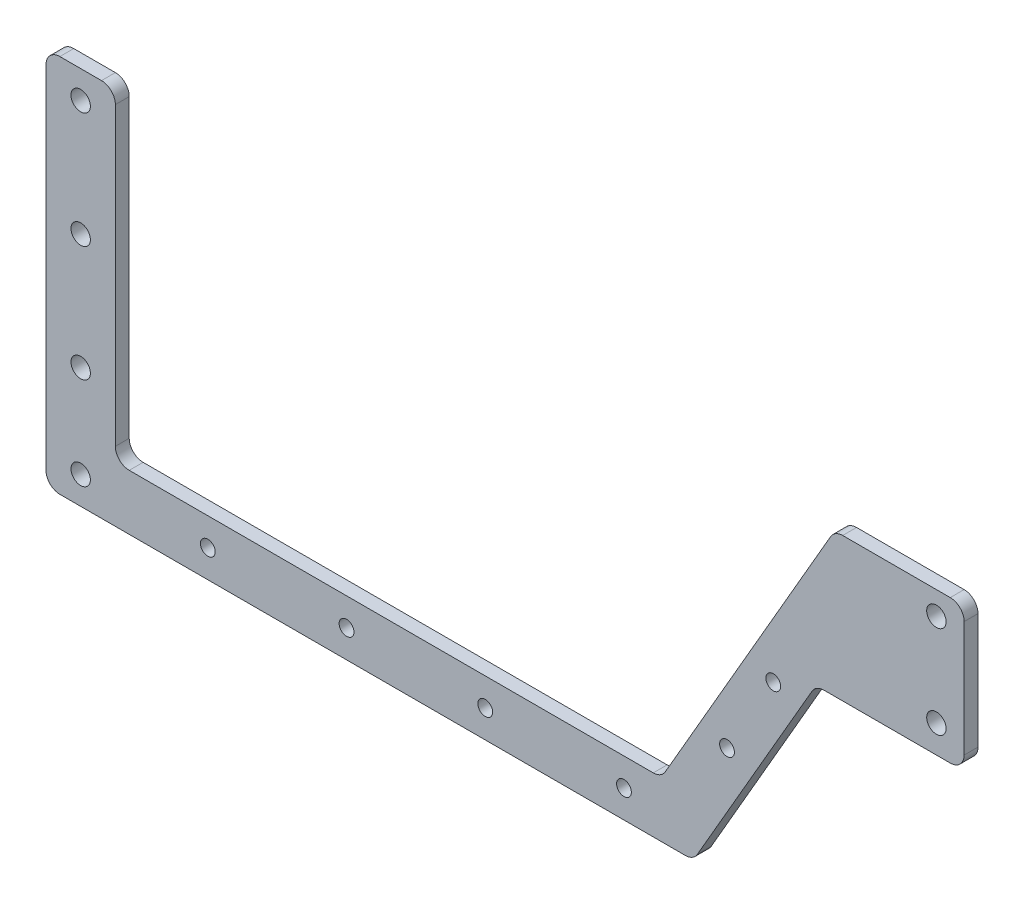
ISO-10303-21;
HEADER;
FILE_DESCRIPTION(('STEP AP214'),'2;1');
FILE_NAME('part.step','',(''),(''),'','','');
FILE_SCHEMA(('AUTOMOTIVE_DESIGN { 1 0 10303 214 1 1 1 1 }'));
ENDSEC;
DATA;
#1=APPLICATION_CONTEXT('core data for automotive mechanical design processes');
#2=APPLICATION_PROTOCOL_DEFINITION('international standard','automotive_design',2000,#1);
#3=PRODUCT_CONTEXT('',#1,'mechanical');
#4=PRODUCT('Part','Part','',(#3));
#5=PRODUCT_RELATED_PRODUCT_CATEGORY('part','',(#4));
#6=PRODUCT_DEFINITION_FORMATION('','',#4);
#7=PRODUCT_DEFINITION_CONTEXT('part definition',#1,'design');
#8=PRODUCT_DEFINITION('design','',#6,#7);
#9=PRODUCT_DEFINITION_SHAPE('','',#8);
#10=(LENGTH_UNIT() NAMED_UNIT(*) SI_UNIT(.MILLI.,.METRE.));
#11=(NAMED_UNIT(*) PLANE_ANGLE_UNIT() SI_UNIT($,.RADIAN.));
#12=(NAMED_UNIT(*) SI_UNIT($,.STERADIAN.) SOLID_ANGLE_UNIT());
#13=UNCERTAINTY_MEASURE_WITH_UNIT(LENGTH_MEASURE(1.E-05),#10,'distance_accuracy_value','');
#14=(GEOMETRIC_REPRESENTATION_CONTEXT(3) GLOBAL_UNCERTAINTY_ASSIGNED_CONTEXT((#13)) GLOBAL_UNIT_ASSIGNED_CONTEXT((#10,
#11,#12)) REPRESENTATION_CONTEXT('',''));
#15=CARTESIAN_POINT('',(0.,0.,0.));
#16=DIRECTION('',(0.,0.,1.));
#17=DIRECTION('',(1.,0.,0.));
#18=AXIS2_PLACEMENT_3D('',#15,#16,#17);
#19=CARTESIAN_POINT('',(0.,0.,3.));
#20=DIRECTION('',(0.,0.,1.));
#21=DIRECTION('',(1.,0.,0.));
#22=AXIS2_PLACEMENT_3D('',#19,#20,#21);
#23=PLANE('',#22);
#24=CARTESIAN_POINT('',(-41.2790561913611,-4.,3.));
#25=DIRECTION('',(0.,0.,1.));
#26=DIRECTION('',(1.,0.,0.));
#27=AXIS2_PLACEMENT_3D('',#24,#25,#26);
#28=CIRCLE('',#27,1.6);
#29=CARTESIAN_POINT('',(-39.6790561913612,-4.,3.));
#30=VERTEX_POINT('',#29);
#31=EDGE_CURVE('E622',#30,#30,#28,.T.);
#32=ORIENTED_EDGE('',*,*,#31,.F.);
#33=EDGE_LOOP('',(#32));
#34=FACE_BOUND('',#33,.T.);
#35=CARTESIAN_POINT('',(-163.571796769724,-39.951905283833,3.));
#36=DIRECTION('',(0.,0.,1.));
#37=DIRECTION('',(1.,0.,0.));
#38=AXIS2_PLACEMENT_3D('',#35,#36,#37);
#39=CIRCLE('',#38,1.59999999999999);
#40=CARTESIAN_POINT('',(-161.971796769724,-39.951905283833,3.));
#41=VERTEX_POINT('',#40);
#42=EDGE_CURVE('E623',#41,#41,#39,.T.);
#43=ORIENTED_EDGE('',*,*,#42,.F.);
#44=EDGE_LOOP('',(#43));
#45=FACE_BOUND('',#44,.T.);
#46=CARTESIAN_POINT('',(-191.071796769724,-19.951905283833,3.));
#47=DIRECTION('',(0.,0.,1.));
#48=DIRECTION('',(1.,0.,0.));
#49=AXIS2_PLACEMENT_3D('',#46,#47,#48);
#50=CIRCLE('',#49,2.09999999999999);
#51=CARTESIAN_POINT('',(-188.971796769724,-19.951905283833,3.));
#52=VERTEX_POINT('',#51);
#53=EDGE_CURVE('E449',#52,#52,#50,.T.);
#54=ORIENTED_EDGE('',*,*,#53,.F.);
#55=EDGE_LOOP('',(#54));
#56=FACE_BOUND('',#55,.T.);
#57=CARTESIAN_POINT('',(-191.071796769724,5.048094716167,3.));
#58=DIRECTION('',(0.,0.,1.));
#59=DIRECTION('',(1.,0.,0.));
#60=AXIS2_PLACEMENT_3D('',#57,#58,#59);
#61=CIRCLE('',#60,2.09999999999999);
#62=CARTESIAN_POINT('',(-188.971796769724,5.048094716167,3.));
#63=VERTEX_POINT('',#62);
#64=EDGE_CURVE('E415',#63,#63,#61,.T.);
#65=ORIENTED_EDGE('',*,*,#64,.F.);
#66=EDGE_LOOP('',(#65));
#67=FACE_BOUND('',#66,.T.);
#68=CARTESIAN_POINT('',(-191.071796769724,30.048094716167,3.));
#69=DIRECTION('',(0.,0.,1.));
#70=DIRECTION('',(1.,0.,0.));
#71=AXIS2_PLACEMENT_3D('',#68,#69,#70);
#72=CIRCLE('',#71,2.09999999999999);
#73=CARTESIAN_POINT('',(-188.971796769724,30.048094716167,3.));
#74=VERTEX_POINT('',#73);
#75=EDGE_CURVE('E431',#74,#74,#72,.T.);
#76=ORIENTED_EDGE('',*,*,#75,.F.);
#77=EDGE_LOOP('',(#76));
#78=FACE_BOUND('',#77,.T.);
#79=CARTESIAN_POINT('',(-191.071796769724,-39.951905283833,3.));
#80=DIRECTION('',(0.,0.,1.));
#81=DIRECTION('',(1.,0.,0.));
#82=AXIS2_PLACEMENT_3D('',#79,#80,#81);
#83=CIRCLE('',#82,2.09999999999999);
#84=CARTESIAN_POINT('',(-188.971796769724,-39.951905283833,3.));
#85=VERTEX_POINT('',#84);
#86=EDGE_CURVE('E440',#85,#85,#83,.T.);
#87=ORIENTED_EDGE('',*,*,#86,.F.);
#88=EDGE_LOOP('',(#87));
#89=FACE_BOUND('',#88,.T.);
#90=CARTESIAN_POINT('',(-133.571796769724,-39.951905283833,3.));
#91=DIRECTION('',(0.,0.,1.));
#92=DIRECTION('',(1.,0.,0.));
#93=AXIS2_PLACEMENT_3D('',#90,#91,#92);
#94=CIRCLE('',#93,1.59999999999999);
#95=CARTESIAN_POINT('',(-131.971796769724,-39.951905283833,3.));
#96=VERTEX_POINT('',#95);
#97=EDGE_CURVE('E448',#96,#96,#94,.T.);
#98=ORIENTED_EDGE('',*,*,#97,.F.);
#99=EDGE_LOOP('',(#98));
#100=FACE_BOUND('',#99,.T.);
#101=CARTESIAN_POINT('',(-103.571796769724,-39.951905283833,3.));
#102=DIRECTION('',(0.,0.,1.));
#103=DIRECTION('',(1.,0.,0.));
#104=AXIS2_PLACEMENT_3D('',#101,#102,#103);
#105=CIRCLE('',#104,1.60000000000002);
#106=CARTESIAN_POINT('',(-101.971796769724,-39.951905283833,3.));
#107=VERTEX_POINT('',#106);
#108=EDGE_CURVE('E483',#107,#107,#105,.T.);
#109=ORIENTED_EDGE('',*,*,#108,.F.);
#110=EDGE_LOOP('',(#109));
#111=FACE_BOUND('',#110,.T.);
#112=CARTESIAN_POINT('',(-73.5717967697243,-39.951905283833,3.));
#113=DIRECTION('',(0.,0.,1.));
#114=DIRECTION('',(1.,0.,0.));
#115=AXIS2_PLACEMENT_3D('',#112,#113,#114);
#116=CIRCLE('',#115,1.60000000000001);
#117=CARTESIAN_POINT('',(-71.9717967697243,-39.951905283833,3.));
#118=VERTEX_POINT('',#117);
#119=EDGE_CURVE('E487',#118,#118,#116,.T.);
#120=ORIENTED_EDGE('',*,*,#119,.F.);
#121=EDGE_LOOP('',(#120));
#122=FACE_BOUND('',#121,.T.);
#123=CARTESIAN_POINT('',(-51.2790561913611,-21.3205080756888,3.));
#124=DIRECTION('',(0.,0.,1.));
#125=DIRECTION('',(1.,0.,0.));
#126=AXIS2_PLACEMENT_3D('',#123,#124,#125);
#127=CIRCLE('',#126,1.6);
#128=CARTESIAN_POINT('',(-49.6790561913612,-21.3205080756888,3.));
#129=VERTEX_POINT('',#128);
#130=EDGE_CURVE('E491',#129,#129,#127,.T.);
#131=ORIENTED_EDGE('',*,*,#130,.F.);
#132=EDGE_LOOP('',(#131));
#133=FACE_BOUND('',#132,.T.);
#134=CARTESIAN_POINT('',(-6.,26.,3.));
#135=DIRECTION('',(0.,0.,1.));
#136=DIRECTION('',(1.,0.,0.));
#137=AXIS2_PLACEMENT_3D('',#134,#135,#136);
#138=CIRCLE('',#137,2.1);
#139=CARTESIAN_POINT('',(-3.9,26.,3.));
#140=VERTEX_POINT('',#139);
#141=EDGE_CURVE('E209',#140,#140,#138,.T.);
#142=ORIENTED_EDGE('',*,*,#141,.F.);
#143=EDGE_LOOP('',(#142));
#144=FACE_BOUND('',#143,.T.);
#145=DIRECTION('',(1.,0.,0.));
#146=VECTOR('',#145,1.);
#147=CARTESIAN_POINT('',(-198.571796769724,-45.951905283833,3.));
#148=LINE('',#147,#146);
#149=CARTESIAN_POINT('',(-195.571796769724,-45.951905283833,3.));
#150=VERTEX_POINT('',#149);
#151=CARTESIAN_POINT('',(-60.3038475772932,-45.951905283833,3.));
#152=VERTEX_POINT('',#151);
#153=EDGE_CURVE('E282',#150,#152,#148,.T.);
#154=ORIENTED_EDGE('',*,*,#153,.T.);
#155=CARTESIAN_POINT('',(-60.3038475772932,-42.951905283833,3.));
#156=DIRECTION('',(0.,0.,1.));
#157=DIRECTION('',(1.,0.,0.));
#158=AXIS2_PLACEMENT_3D('',#155,#156,#157);
#159=CIRCLE('',#158,3.);
#160=CARTESIAN_POINT('',(-57.7057713659398,-44.4519052838329,3.));
#161=VERTEX_POINT('',#160);
#162=EDGE_CURVE('E296',#152,#161,#159,.T.);
#163=ORIENTED_EDGE('',*,*,#162,.T.);
#164=DIRECTION('',(0.499999999999998,0.86602540378444,0.));
#165=VECTOR('',#164,1.);
#166=CARTESIAN_POINT('',(-58.5717967697243,-45.951905283833,3.));
#167=LINE('',#166,#165);
#168=CARTESIAN_POINT('',(-32.9074772881117,-1.50000000000002,3.));
#169=VERTEX_POINT('',#168);
#170=EDGE_CURVE('E219',#161,#169,#167,.T.);
#171=ORIENTED_EDGE('',*,*,#170,.T.);
#172=CARTESIAN_POINT('',(-30.3094010767584,-3.,3.));
#173=DIRECTION('',(0.,0.,1.));
#174=DIRECTION('',(1.,0.,0.));
#175=AXIS2_PLACEMENT_3D('',#172,#173,#174);
#176=CIRCLE('',#175,3.);
#177=CARTESIAN_POINT('',(-30.3094010767584,0.,3.));
#178=VERTEX_POINT('',#177);
#179=EDGE_CURVE('E190',#169,#178,#176,.F.);
#180=ORIENTED_EDGE('',*,*,#179,.T.);
#181=DIRECTION('',(1.,0.,0.));
#182=VECTOR('',#181,1.);
#183=CARTESIAN_POINT('',(-32.0414518843273,0.,3.));
#184=LINE('',#183,#182);
#185=CARTESIAN_POINT('',(-3.,0.,3.));
#186=VERTEX_POINT('',#185);
#187=EDGE_CURVE('E200',#178,#186,#184,.T.);
#188=ORIENTED_EDGE('',*,*,#187,.T.);
#189=CARTESIAN_POINT('',(-3.,3.,3.));
#190=DIRECTION('',(0.,0.,1.));
#191=DIRECTION('',(1.,0.,0.));
#192=AXIS2_PLACEMENT_3D('',#189,#190,#191);
#193=CIRCLE('',#192,3.);
#194=CARTESIAN_POINT('',(0.,3.,3.));
#195=VERTEX_POINT('',#194);
#196=EDGE_CURVE('E269',#186,#195,#193,.T.);
#197=ORIENTED_EDGE('',*,*,#196,.T.);
#198=DIRECTION('',(0.,1.,0.));
#199=VECTOR('',#198,1.);
#200=CARTESIAN_POINT('',(0.,0.,3.));
#201=LINE('',#200,#199);
#202=CARTESIAN_POINT('',(0.,28.,3.));
#203=VERTEX_POINT('',#202);
#204=EDGE_CURVE('E395',#195,#203,#201,.T.);
#205=ORIENTED_EDGE('',*,*,#204,.T.);
#206=CARTESIAN_POINT('',(-3.,28.,3.));
#207=DIRECTION('',(0.,0.,1.));
#208=DIRECTION('',(1.,0.,0.));
#209=AXIS2_PLACEMENT_3D('',#206,#207,#208);
#210=CIRCLE('',#209,3.);
#211=CARTESIAN_POINT('',(-3.,31.,3.));
#212=VERTEX_POINT('',#211);
#213=EDGE_CURVE('E386',#203,#212,#210,.T.);
#214=ORIENTED_EDGE('',*,*,#213,.T.);
#215=DIRECTION('',(-1.,0.,0.));
#216=VECTOR('',#215,1.);
#217=CARTESIAN_POINT('',(0.,31.,3.));
#218=LINE('',#217,#216);
#219=CARTESIAN_POINT('',(-26.2679491924311,31.,3.));
#220=VERTEX_POINT('',#219);
#221=EDGE_CURVE('E369',#212,#220,#218,.T.);
#222=ORIENTED_EDGE('',*,*,#221,.T.);
#223=CARTESIAN_POINT('',(-26.2679491924311,28.,3.));
#224=DIRECTION('',(0.,0.,1.));
#225=DIRECTION('',(1.,0.,0.));
#226=AXIS2_PLACEMENT_3D('',#223,#224,#225);
#227=CIRCLE('',#226,3.);
#228=CARTESIAN_POINT('',(-28.8660254037844,29.5,3.));
#229=VERTEX_POINT('',#228);
#230=EDGE_CURVE('E383',#220,#229,#227,.T.);
#231=ORIENTED_EDGE('',*,*,#230,.T.);
#232=DIRECTION('',(-0.499999999999998,-0.86602540378444,0.));
#233=VECTOR('',#232,1.);
#234=CARTESIAN_POINT('',(-28.,31.,3.));
#235=LINE('',#234,#233);
#236=CARTESIAN_POINT('',(-64.6339745962154,-32.451905283833,3.));
#237=VERTEX_POINT('',#236);
#238=EDGE_CURVE('E359',#229,#237,#235,.T.);
#239=ORIENTED_EDGE('',*,*,#238,.T.);
#240=CARTESIAN_POINT('',(-67.2320508075687,-30.951905283833,3.));
#241=DIRECTION('',(0.,0.,1.));
#242=DIRECTION('',(1.,0.,0.));
#243=AXIS2_PLACEMENT_3D('',#240,#241,#242);
#244=CIRCLE('',#243,3.);
#245=CARTESIAN_POINT('',(-67.2320508075687,-33.951905283833,3.));
#246=VERTEX_POINT('',#245);
#247=EDGE_CURVE('E12',#237,#246,#244,.F.);
#248=ORIENTED_EDGE('',*,*,#247,.T.);
#249=DIRECTION('',(-1.,0.,0.));
#250=VECTOR('',#249,1.);
#251=CARTESIAN_POINT('',(-65.4999999999998,-33.951905283833,3.));
#252=LINE('',#251,#250);
#253=CARTESIAN_POINT('',(-180.571796769724,-33.951905283833,3.));
#254=VERTEX_POINT('',#253);
#255=EDGE_CURVE('E357',#246,#254,#252,.T.);
#256=ORIENTED_EDGE('',*,*,#255,.T.);
#257=CARTESIAN_POINT('',(-180.571796769724,-30.951905283833,3.));
#258=DIRECTION('',(0.,0.,1.));
#259=DIRECTION('',(1.,0.,0.));
#260=AXIS2_PLACEMENT_3D('',#257,#258,#259);
#261=CIRCLE('',#260,3.);
#262=CARTESIAN_POINT('',(-183.571796769724,-30.951905283833,3.));
#263=VERTEX_POINT('',#262);
#264=EDGE_CURVE('E340',#254,#263,#261,.F.);
#265=ORIENTED_EDGE('',*,*,#264,.T.);
#266=DIRECTION('',(0.,1.,0.));
#267=VECTOR('',#266,1.);
#268=CARTESIAN_POINT('',(-183.571796769724,-33.951905283833,3.));
#269=LINE('',#268,#267);
#270=CARTESIAN_POINT('',(-183.571796769724,33.048094716167,3.));
#271=VERTEX_POINT('',#270);
#272=EDGE_CURVE('E364',#263,#271,#269,.T.);
#273=ORIENTED_EDGE('',*,*,#272,.T.);
#274=CARTESIAN_POINT('',(-186.571796769724,33.048094716167,3.));
#275=DIRECTION('',(0.,0.,1.));
#276=DIRECTION('',(1.,0.,0.));
#277=AXIS2_PLACEMENT_3D('',#274,#275,#276);
#278=CIRCLE('',#277,3.);
#279=CARTESIAN_POINT('',(-186.571796769724,36.048094716167,3.));
#280=VERTEX_POINT('',#279);
#281=EDGE_CURVE('E379',#271,#280,#278,.T.);
#282=ORIENTED_EDGE('',*,*,#281,.T.);
#283=DIRECTION('',(-1.,0.,0.));
#284=VECTOR('',#283,1.);
#285=CARTESIAN_POINT('',(-183.571796769724,36.048094716167,3.));
#286=LINE('',#285,#284);
#287=CARTESIAN_POINT('',(-195.571796769724,36.048094716167,3.));
#288=VERTEX_POINT('',#287);
#289=EDGE_CURVE('E283',#280,#288,#286,.T.);
#290=ORIENTED_EDGE('',*,*,#289,.T.);
#291=CARTESIAN_POINT('',(-195.571796769724,33.048094716167,3.));
#292=DIRECTION('',(0.,0.,1.));
#293=DIRECTION('',(1.,0.,0.));
#294=AXIS2_PLACEMENT_3D('',#291,#292,#293);
#295=CIRCLE('',#294,3.);
#296=CARTESIAN_POINT('',(-198.571796769724,33.048094716167,3.));
#297=VERTEX_POINT('',#296);
#298=EDGE_CURVE('E64',#288,#297,#295,.T.);
#299=ORIENTED_EDGE('',*,*,#298,.T.);
#300=DIRECTION('',(0.,-1.,0.));
#301=VECTOR('',#300,1.);
#302=CARTESIAN_POINT('',(-198.571796769724,36.048094716167,3.));
#303=LINE('',#302,#301);
#304=CARTESIAN_POINT('',(-198.571796769724,-42.951905283833,3.));
#305=VERTEX_POINT('',#304);
#306=EDGE_CURVE('E279',#297,#305,#303,.T.);
#307=ORIENTED_EDGE('',*,*,#306,.T.);
#308=CARTESIAN_POINT('',(-195.571796769724,-42.951905283833,3.));
#309=DIRECTION('',(0.,0.,1.));
#310=DIRECTION('',(1.,0.,0.));
#311=AXIS2_PLACEMENT_3D('',#308,#309,#310);
#312=CIRCLE('',#311,3.);
#313=EDGE_CURVE('E301',#305,#150,#312,.T.);
#314=ORIENTED_EDGE('',*,*,#313,.T.);
#315=EDGE_LOOP('',(#154,#163,#171,#180,#188,#197,#205,#214,#222,#231,#239,#248,#256,#265,#273,
#282,#290,#299,#307,#314));
#316=FACE_BOUND('',#315,.T.);
#317=CARTESIAN_POINT('',(-6.,6.,3.));
#318=DIRECTION('',(0.,0.,1.));
#319=DIRECTION('',(1.,0.,0.));
#320=AXIS2_PLACEMENT_3D('',#317,#318,#319);
#321=CIRCLE('',#320,2.1);
#322=CARTESIAN_POINT('',(-3.9,6.,3.));
#323=VERTEX_POINT('',#322);
#324=EDGE_CURVE('E405',#323,#323,#321,.T.);
#325=ORIENTED_EDGE('',*,*,#324,.F.);
#326=EDGE_LOOP('',(#325));
#327=FACE_BOUND('',#326,.T.);
#328=ADVANCED_FACE('F41',(#34,#45,#56,#67,#78,#89,#100,#111,#122,#133,#144,#316,#327),#23,.T.);
#329=CARTESIAN_POINT('',(0.,0.,0.));
#330=DIRECTION('',(0.,0.,1.));
#331=DIRECTION('',(1.,0.,0.));
#332=AXIS2_PLACEMENT_3D('',#329,#330,#331);
#333=PLANE('',#332);
#334=CARTESIAN_POINT('',(-41.2790561913611,-4.,0.));
#335=DIRECTION('',(0.,0.,1.));
#336=DIRECTION('',(1.,0.,0.));
#337=AXIS2_PLACEMENT_3D('',#334,#335,#336);
#338=CIRCLE('',#337,1.6);
#339=CARTESIAN_POINT('',(-39.6790561913612,-4.,0.));
#340=VERTEX_POINT('',#339);
#341=EDGE_CURVE('E410',#340,#340,#338,.T.);
#342=ORIENTED_EDGE('',*,*,#341,.T.);
#343=EDGE_LOOP('',(#342));
#344=FACE_BOUND('',#343,.T.);
#345=CARTESIAN_POINT('',(-163.571796769724,-39.951905283833,0.));
#346=DIRECTION('',(0.,0.,1.));
#347=DIRECTION('',(1.,0.,0.));
#348=AXIS2_PLACEMENT_3D('',#345,#346,#347);
#349=CIRCLE('',#348,1.59999999999999);
#350=CARTESIAN_POINT('',(-161.971796769724,-39.951905283833,0.));
#351=VERTEX_POINT('',#350);
#352=EDGE_CURVE('E445',#351,#351,#349,.T.);
#353=ORIENTED_EDGE('',*,*,#352,.T.);
#354=EDGE_LOOP('',(#353));
#355=FACE_BOUND('',#354,.T.);
#356=CARTESIAN_POINT('',(-191.071796769724,-19.951905283833,0.));
#357=DIRECTION('',(0.,0.,1.));
#358=DIRECTION('',(1.,0.,0.));
#359=AXIS2_PLACEMENT_3D('',#356,#357,#358);
#360=CIRCLE('',#359,2.09999999999999);
#361=CARTESIAN_POINT('',(-188.971796769724,-19.951905283833,0.));
#362=VERTEX_POINT('',#361);
#363=EDGE_CURVE('E446',#362,#362,#360,.T.);
#364=ORIENTED_EDGE('',*,*,#363,.T.);
#365=EDGE_LOOP('',(#364));
#366=FACE_BOUND('',#365,.T.);
#367=CARTESIAN_POINT('',(-191.071796769724,5.048094716167,0.));
#368=DIRECTION('',(0.,0.,1.));
#369=DIRECTION('',(1.,0.,0.));
#370=AXIS2_PLACEMENT_3D('',#367,#368,#369);
#371=CIRCLE('',#370,2.09999999999999);
#372=CARTESIAN_POINT('',(-188.971796769724,5.048094716167,0.));
#373=VERTEX_POINT('',#372);
#374=EDGE_CURVE('E420',#373,#373,#371,.T.);
#375=ORIENTED_EDGE('',*,*,#374,.T.);
#376=EDGE_LOOP('',(#375));
#377=FACE_BOUND('',#376,.T.);
#378=CARTESIAN_POINT('',(-191.071796769724,30.048094716167,0.));
#379=DIRECTION('',(0.,0.,1.));
#380=DIRECTION('',(1.,0.,0.));
#381=AXIS2_PLACEMENT_3D('',#378,#379,#380);
#382=CIRCLE('',#381,2.09999999999999);
#383=CARTESIAN_POINT('',(-188.971796769724,30.048094716167,0.));
#384=VERTEX_POINT('',#383);
#385=EDGE_CURVE('E421',#384,#384,#382,.T.);
#386=ORIENTED_EDGE('',*,*,#385,.T.);
#387=EDGE_LOOP('',(#386));
#388=FACE_BOUND('',#387,.T.);
#389=CARTESIAN_POINT('',(-191.071796769724,-39.951905283833,0.));
#390=DIRECTION('',(0.,0.,1.));
#391=DIRECTION('',(1.,0.,0.));
#392=AXIS2_PLACEMENT_3D('',#389,#390,#391);
#393=CIRCLE('',#392,2.09999999999999);
#394=CARTESIAN_POINT('',(-188.971796769724,-39.951905283833,0.));
#395=VERTEX_POINT('',#394);
#396=EDGE_CURVE('E437',#395,#395,#393,.T.);
#397=ORIENTED_EDGE('',*,*,#396,.T.);
#398=EDGE_LOOP('',(#397));
#399=FACE_BOUND('',#398,.T.);
#400=CARTESIAN_POINT('',(-133.571796769724,-39.951905283833,0.));
#401=DIRECTION('',(0.,0.,1.));
#402=DIRECTION('',(1.,0.,0.));
#403=AXIS2_PLACEMENT_3D('',#400,#401,#402);
#404=CIRCLE('',#403,1.59999999999999);
#405=CARTESIAN_POINT('',(-131.971796769724,-39.951905283833,0.));
#406=VERTEX_POINT('',#405);
#407=EDGE_CURVE('E604',#406,#406,#404,.T.);
#408=ORIENTED_EDGE('',*,*,#407,.T.);
#409=EDGE_LOOP('',(#408));
#410=FACE_BOUND('',#409,.T.);
#411=CARTESIAN_POINT('',(-103.571796769724,-39.951905283833,0.));
#412=DIRECTION('',(0.,0.,1.));
#413=DIRECTION('',(1.,0.,0.));
#414=AXIS2_PLACEMENT_3D('',#411,#412,#413);
#415=CIRCLE('',#414,1.60000000000002);
#416=CARTESIAN_POINT('',(-101.971796769724,-39.951905283833,0.));
#417=VERTEX_POINT('',#416);
#418=EDGE_CURVE('E601',#417,#417,#415,.T.);
#419=ORIENTED_EDGE('',*,*,#418,.T.);
#420=EDGE_LOOP('',(#419));
#421=FACE_BOUND('',#420,.T.);
#422=CARTESIAN_POINT('',(-73.5717967697243,-39.951905283833,0.));
#423=DIRECTION('',(0.,0.,1.));
#424=DIRECTION('',(1.,0.,0.));
#425=AXIS2_PLACEMENT_3D('',#422,#423,#424);
#426=CIRCLE('',#425,1.60000000000001);
#427=CARTESIAN_POINT('',(-71.9717967697243,-39.951905283833,0.));
#428=VERTEX_POINT('',#427);
#429=EDGE_CURVE('E598',#428,#428,#426,.T.);
#430=ORIENTED_EDGE('',*,*,#429,.T.);
#431=EDGE_LOOP('',(#430));
#432=FACE_BOUND('',#431,.T.);
#433=CARTESIAN_POINT('',(-51.2790561913611,-21.3205080756888,0.));
#434=DIRECTION('',(0.,0.,1.));
#435=DIRECTION('',(1.,0.,0.));
#436=AXIS2_PLACEMENT_3D('',#433,#434,#435);
#437=CIRCLE('',#436,1.6);
#438=CARTESIAN_POINT('',(-49.6790561913612,-21.3205080756888,0.));
#439=VERTEX_POINT('',#438);
#440=EDGE_CURVE('E597',#439,#439,#437,.T.);
#441=ORIENTED_EDGE('',*,*,#440,.T.);
#442=EDGE_LOOP('',(#441));
#443=FACE_BOUND('',#442,.T.);
#444=DIRECTION('',(0.499999999999998,0.86602540378444,0.));
#445=VECTOR('',#444,1.);
#446=CARTESIAN_POINT('',(-58.5717967697243,-45.951905283833,0.));
#447=LINE('',#446,#445);
#448=CARTESIAN_POINT('',(-57.7057713659398,-44.4519052838329,0.));
#449=VERTEX_POINT('',#448);
#450=CARTESIAN_POINT('',(-32.9074772881117,-1.50000000000002,0.));
#451=VERTEX_POINT('',#450);
#452=EDGE_CURVE('E242',#449,#451,#447,.T.);
#453=ORIENTED_EDGE('',*,*,#452,.F.);
#454=CARTESIAN_POINT('',(-60.3038475772932,-42.951905283833,0.));
#455=DIRECTION('',(0.,0.,1.));
#456=DIRECTION('',(1.,0.,0.));
#457=AXIS2_PLACEMENT_3D('',#454,#455,#456);
#458=CIRCLE('',#457,3.);
#459=CARTESIAN_POINT('',(-60.3038475772932,-45.951905283833,0.));
#460=VERTEX_POINT('',#459);
#461=EDGE_CURVE('E259',#449,#460,#458,.F.);
#462=ORIENTED_EDGE('',*,*,#461,.T.);
#463=DIRECTION('',(1.,0.,0.));
#464=VECTOR('',#463,1.);
#465=CARTESIAN_POINT('',(-198.571796769724,-45.951905283833,0.));
#466=LINE('',#465,#464);
#467=CARTESIAN_POINT('',(-195.571796769724,-45.951905283833,0.));
#468=VERTEX_POINT('',#467);
#469=EDGE_CURVE('E239',#468,#460,#466,.T.);
#470=ORIENTED_EDGE('',*,*,#469,.F.);
#471=CARTESIAN_POINT('',(-195.571796769724,-42.951905283833,0.));
#472=DIRECTION('',(0.,0.,1.));
#473=DIRECTION('',(1.,0.,0.));
#474=AXIS2_PLACEMENT_3D('',#471,#472,#473);
#475=CIRCLE('',#474,3.);
#476=CARTESIAN_POINT('',(-198.571796769724,-42.951905283833,0.));
#477=VERTEX_POINT('',#476);
#478=EDGE_CURVE('E257',#468,#477,#475,.F.);
#479=ORIENTED_EDGE('',*,*,#478,.T.);
#480=DIRECTION('',(0.,-1.,0.));
#481=VECTOR('',#480,1.);
#482=CARTESIAN_POINT('',(-198.571796769724,36.048094716167,0.));
#483=LINE('',#482,#481);
#484=CARTESIAN_POINT('',(-198.571796769724,33.048094716167,0.));
#485=VERTEX_POINT('',#484);
#486=EDGE_CURVE('E237',#485,#477,#483,.T.);
#487=ORIENTED_EDGE('',*,*,#486,.F.);
#488=CARTESIAN_POINT('',(-195.571796769724,33.048094716167,0.));
#489=DIRECTION('',(0.,0.,1.));
#490=DIRECTION('',(1.,0.,0.));
#491=AXIS2_PLACEMENT_3D('',#488,#489,#490);
#492=CIRCLE('',#491,3.);
#493=CARTESIAN_POINT('',(-195.571796769724,36.048094716167,0.));
#494=VERTEX_POINT('',#493);
#495=EDGE_CURVE('E248',#485,#494,#492,.F.);
#496=ORIENTED_EDGE('',*,*,#495,.T.);
#497=DIRECTION('',(-1.,0.,0.));
#498=VECTOR('',#497,1.);
#499=CARTESIAN_POINT('',(-183.571796769724,36.048094716167,0.));
#500=LINE('',#499,#498);
#501=CARTESIAN_POINT('',(-186.571796769724,36.048094716167,0.));
#502=VERTEX_POINT('',#501);
#503=EDGE_CURVE('E234',#502,#494,#500,.T.);
#504=ORIENTED_EDGE('',*,*,#503,.F.);
#505=CARTESIAN_POINT('',(-186.571796769724,33.048094716167,0.));
#506=DIRECTION('',(0.,0.,1.));
#507=DIRECTION('',(1.,0.,0.));
#508=AXIS2_PLACEMENT_3D('',#505,#506,#507);
#509=CIRCLE('',#508,3.);
#510=CARTESIAN_POINT('',(-183.571796769724,33.048094716167,0.));
#511=VERTEX_POINT('',#510);
#512=EDGE_CURVE('E255',#502,#511,#509,.F.);
#513=ORIENTED_EDGE('',*,*,#512,.T.);
#514=DIRECTION('',(0.,1.,0.));
#515=VECTOR('',#514,1.);
#516=CARTESIAN_POINT('',(-183.571796769724,-33.951905283833,0.));
#517=LINE('',#516,#515);
#518=CARTESIAN_POINT('',(-183.571796769724,-30.951905283833,0.));
#519=VERTEX_POINT('',#518);
#520=EDGE_CURVE('E231',#519,#511,#517,.T.);
#521=ORIENTED_EDGE('',*,*,#520,.F.);
#522=CARTESIAN_POINT('',(-180.571796769724,-30.951905283833,0.));
#523=DIRECTION('',(0.,0.,1.));
#524=DIRECTION('',(1.,0.,0.));
#525=AXIS2_PLACEMENT_3D('',#522,#523,#524);
#526=CIRCLE('',#525,3.);
#527=CARTESIAN_POINT('',(-180.571796769724,-33.951905283833,0.));
#528=VERTEX_POINT('',#527);
#529=EDGE_CURVE('E338',#519,#528,#526,.T.);
#530=ORIENTED_EDGE('',*,*,#529,.T.);
#531=DIRECTION('',(-1.,0.,0.));
#532=VECTOR('',#531,1.);
#533=CARTESIAN_POINT('',(-65.4999999999998,-33.951905283833,0.));
#534=LINE('',#533,#532);
#535=CARTESIAN_POINT('',(-67.2320508075687,-33.951905283833,0.));
#536=VERTEX_POINT('',#535);
#537=EDGE_CURVE('E228',#536,#528,#534,.T.);
#538=ORIENTED_EDGE('',*,*,#537,.F.);
#539=CARTESIAN_POINT('',(-67.2320508075687,-30.951905283833,0.));
#540=DIRECTION('',(0.,0.,1.));
#541=DIRECTION('',(1.,0.,0.));
#542=AXIS2_PLACEMENT_3D('',#539,#540,#541);
#543=CIRCLE('',#542,3.);
#544=CARTESIAN_POINT('',(-64.6339745962154,-32.451905283833,0.));
#545=VERTEX_POINT('',#544);
#546=EDGE_CURVE('E50',#536,#545,#543,.T.);
#547=ORIENTED_EDGE('',*,*,#546,.T.);
#548=DIRECTION('',(-0.499999999999998,-0.86602540378444,0.));
#549=VECTOR('',#548,1.);
#550=CARTESIAN_POINT('',(-28.,31.,0.));
#551=LINE('',#550,#549);
#552=CARTESIAN_POINT('',(-28.8660254037844,29.5,0.));
#553=VERTEX_POINT('',#552);
#554=EDGE_CURVE('E225',#553,#545,#551,.T.);
#555=ORIENTED_EDGE('',*,*,#554,.F.);
#556=CARTESIAN_POINT('',(-26.2679491924311,28.,0.));
#557=DIRECTION('',(0.,0.,1.));
#558=DIRECTION('',(1.,0.,0.));
#559=AXIS2_PLACEMENT_3D('',#556,#557,#558);
#560=CIRCLE('',#559,3.);
#561=CARTESIAN_POINT('',(-26.2679491924311,31.,0.));
#562=VERTEX_POINT('',#561);
#563=EDGE_CURVE('E253',#553,#562,#560,.F.);
#564=ORIENTED_EDGE('',*,*,#563,.T.);
#565=DIRECTION('',(-1.,0.,0.));
#566=VECTOR('',#565,1.);
#567=CARTESIAN_POINT('',(0.,31.,0.));
#568=LINE('',#567,#566);
#569=CARTESIAN_POINT('',(-3.,31.,0.));
#570=VERTEX_POINT('',#569);
#571=EDGE_CURVE('E212',#570,#562,#568,.T.);
#572=ORIENTED_EDGE('',*,*,#571,.F.);
#573=CARTESIAN_POINT('',(-3.,28.,0.));
#574=DIRECTION('',(0.,0.,1.));
#575=DIRECTION('',(1.,0.,0.));
#576=AXIS2_PLACEMENT_3D('',#573,#574,#575);
#577=CIRCLE('',#576,3.);
#578=CARTESIAN_POINT('',(0.,28.,0.));
#579=VERTEX_POINT('',#578);
#580=EDGE_CURVE('E251',#570,#579,#577,.F.);
#581=ORIENTED_EDGE('',*,*,#580,.T.);
#582=DIRECTION('',(0.,1.,0.));
#583=VECTOR('',#582,1.);
#584=CARTESIAN_POINT('',(0.,0.,0.));
#585=LINE('',#584,#583);
#586=CARTESIAN_POINT('',(0.,3.,0.));
#587=VERTEX_POINT('',#586);
#588=EDGE_CURVE('E208',#587,#579,#585,.T.);
#589=ORIENTED_EDGE('',*,*,#588,.F.);
#590=CARTESIAN_POINT('',(-3.,3.,0.));
#591=DIRECTION('',(0.,0.,1.));
#592=DIRECTION('',(1.,0.,0.));
#593=AXIS2_PLACEMENT_3D('',#590,#591,#592);
#594=CIRCLE('',#593,3.);
#595=CARTESIAN_POINT('',(-3.,0.,0.));
#596=VERTEX_POINT('',#595);
#597=EDGE_CURVE('E207',#587,#596,#594,.F.);
#598=ORIENTED_EDGE('',*,*,#597,.T.);
#599=DIRECTION('',(1.,0.,0.));
#600=VECTOR('',#599,1.);
#601=CARTESIAN_POINT('',(-32.0414518843273,0.,0.));
#602=LINE('',#601,#600);
#603=CARTESIAN_POINT('',(-30.3094010767584,0.,0.));
#604=VERTEX_POINT('',#603);
#605=EDGE_CURVE('E197',#604,#596,#602,.T.);
#606=ORIENTED_EDGE('',*,*,#605,.F.);
#607=CARTESIAN_POINT('',(-30.3094010767584,-3.,0.));
#608=DIRECTION('',(0.,0.,1.));
#609=DIRECTION('',(1.,0.,0.));
#610=AXIS2_PLACEMENT_3D('',#607,#608,#609);
#611=CIRCLE('',#610,3.);
#612=EDGE_CURVE('E180',#604,#451,#611,.T.);
#613=ORIENTED_EDGE('',*,*,#612,.T.);
#614=EDGE_LOOP('',(#453,#462,#470,#479,#487,#496,#504,#513,#521,#530,#538,#547,#555,#564,#572,
#581,#589,#598,#606,#613));
#615=FACE_BOUND('',#614,.T.);
#616=CARTESIAN_POINT('',(-6.,26.,0.));
#617=DIRECTION('',(0.,0.,1.));
#618=DIRECTION('',(1.,0.,0.));
#619=AXIS2_PLACEMENT_3D('',#616,#617,#618);
#620=CIRCLE('',#619,2.1);
#621=CARTESIAN_POINT('',(-3.9,26.,0.));
#622=VERTEX_POINT('',#621);
#623=EDGE_CURVE('E216',#622,#622,#620,.T.);
#624=ORIENTED_EDGE('',*,*,#623,.T.);
#625=EDGE_LOOP('',(#624));
#626=FACE_BOUND('',#625,.T.);
#627=CARTESIAN_POINT('',(-6.,6.,0.));
#628=DIRECTION('',(0.,0.,1.));
#629=DIRECTION('',(1.,0.,0.));
#630=AXIS2_PLACEMENT_3D('',#627,#628,#629);
#631=CIRCLE('',#630,2.1);
#632=CARTESIAN_POINT('',(-3.9,6.,0.));
#633=VERTEX_POINT('',#632);
#634=EDGE_CURVE('E408',#633,#633,#631,.T.);
#635=ORIENTED_EDGE('',*,*,#634,.T.);
#636=EDGE_LOOP('',(#635));
#637=FACE_BOUND('',#636,.T.);
#638=ADVANCED_FACE('F204',(#344,#355,#366,#377,#388,#399,#410,#421,#432,#443,#615,#626,#637),
#333,.F.);
#639=CARTESIAN_POINT('',(-32.0414518843273,0.,3.));
#640=DIRECTION('',(0.,1.,0.));
#641=DIRECTION('',(0.,0.,1.));
#642=AXIS2_PLACEMENT_3D('',#639,#640,#641);
#643=PLANE('',#642);
#644=ORIENTED_EDGE('',*,*,#187,.F.);
#645=DIRECTION('',(0.,0.,-1.));
#646=VECTOR('',#645,1.);
#647=CARTESIAN_POINT('',(-30.3094010767584,0.,0.));
#648=LINE('',#647,#646);
#649=EDGE_CURVE('E184',#178,#604,#648,.T.);
#650=ORIENTED_EDGE('',*,*,#649,.T.);
#651=ORIENTED_EDGE('',*,*,#605,.T.);
#652=DIRECTION('',(0.,0.,-1.));
#653=VECTOR('',#652,1.);
#654=CARTESIAN_POINT('',(-3.,0.,3.));
#655=LINE('',#654,#653);
#656=EDGE_CURVE('E202',#596,#186,#655,.F.);
#657=ORIENTED_EDGE('',*,*,#656,.T.);
#658=EDGE_LOOP('',(#644,#650,#651,#657));
#659=FACE_BOUND('',#658,.T.);
#660=ADVANCED_FACE('F196',(#659),#643,.F.);
#661=CARTESIAN_POINT('',(0.,0.,3.));
#662=DIRECTION('',(-1.,0.,0.));
#663=DIRECTION('',(0.,0.,1.));
#664=AXIS2_PLACEMENT_3D('',#661,#662,#663);
#665=PLANE('',#664);
#666=ORIENTED_EDGE('',*,*,#588,.T.);
#667=DIRECTION('',(0.,0.,-1.));
#668=VECTOR('',#667,1.);
#669=CARTESIAN_POINT('',(0.,28.,3.));
#670=LINE('',#669,#668);
#671=EDGE_CURVE('E191',#579,#203,#670,.F.);
#672=ORIENTED_EDGE('',*,*,#671,.T.);
#673=ORIENTED_EDGE('',*,*,#204,.F.);
#674=DIRECTION('',(0.,0.,-1.));
#675=VECTOR('',#674,1.);
#676=CARTESIAN_POINT('',(0.,3.,3.));
#677=LINE('',#676,#675);
#678=EDGE_CURVE('E332',#195,#587,#677,.T.);
#679=ORIENTED_EDGE('',*,*,#678,.T.);
#680=EDGE_LOOP('',(#666,#672,#673,#679));
#681=FACE_BOUND('',#680,.T.);
#682=ADVANCED_FACE('F542',(#681),#665,.F.);
#683=CARTESIAN_POINT('',(0.,31.,3.));
#684=DIRECTION('',(0.,-1.,0.));
#685=DIRECTION('',(1.,0.,0.));
#686=AXIS2_PLACEMENT_3D('',#683,#684,#685);
#687=PLANE('',#686);
#688=ORIENTED_EDGE('',*,*,#571,.T.);
#689=DIRECTION('',(0.,0.,-1.));
#690=VECTOR('',#689,1.);
#691=CARTESIAN_POINT('',(-26.2679491924311,31.,3.));
#692=LINE('',#691,#690);
#693=EDGE_CURVE('E330',#562,#220,#692,.F.);
#694=ORIENTED_EDGE('',*,*,#693,.T.);
#695=ORIENTED_EDGE('',*,*,#221,.F.);
#696=DIRECTION('',(0.,0.,-1.));
#697=VECTOR('',#696,1.);
#698=CARTESIAN_POINT('',(-3.,31.,3.));
#699=LINE('',#698,#697);
#700=EDGE_CURVE('E327',#212,#570,#699,.T.);
#701=ORIENTED_EDGE('',*,*,#700,.T.);
#702=EDGE_LOOP('',(#688,#694,#695,#701));
#703=FACE_BOUND('',#702,.T.);
#704=ADVANCED_FACE('F539',(#703),#687,.F.);
#705=CARTESIAN_POINT('',(-28.,31.,3.));
#706=DIRECTION('',(0.86602540378444,-0.499999999999998,0.));
#707=DIRECTION('',(0.499999999999998,0.86602540378444,0.));
#708=AXIS2_PLACEMENT_3D('',#705,#706,#707);
#709=PLANE('',#708);
#710=ORIENTED_EDGE('',*,*,#554,.T.);
#711=DIRECTION('',(0.,0.,-1.));
#712=VECTOR('',#711,1.);
#713=CARTESIAN_POINT('',(-64.6339745962154,-32.451905283833,3.));
#714=LINE('',#713,#712);
#715=EDGE_CURVE('E325',#545,#237,#714,.F.);
#716=ORIENTED_EDGE('',*,*,#715,.T.);
#717=ORIENTED_EDGE('',*,*,#238,.F.);
#718=DIRECTION('',(0.,0.,-1.));
#719=VECTOR('',#718,1.);
#720=CARTESIAN_POINT('',(-28.8660254037844,29.5,3.));
#721=LINE('',#720,#719);
#722=EDGE_CURVE('E322',#229,#553,#721,.T.);
#723=ORIENTED_EDGE('',*,*,#722,.T.);
#724=EDGE_LOOP('',(#710,#716,#717,#723));
#725=FACE_BOUND('',#724,.T.);
#726=ADVANCED_FACE('F348',(#725),#709,.F.);
#727=CARTESIAN_POINT('',(-65.4999999999998,-33.951905283833,3.));
#728=DIRECTION('',(0.,-1.,0.));
#729=DIRECTION('',(1.,0.,0.));
#730=AXIS2_PLACEMENT_3D('',#727,#728,#729);
#731=PLANE('',#730);
#732=ORIENTED_EDGE('',*,*,#537,.T.);
#733=DIRECTION('',(0.,0.,-1.));
#734=VECTOR('',#733,1.);
#735=CARTESIAN_POINT('',(-180.571796769724,-33.951905283833,3.));
#736=LINE('',#735,#734);
#737=EDGE_CURVE('E320',#528,#254,#736,.F.);
#738=ORIENTED_EDGE('',*,*,#737,.T.);
#739=ORIENTED_EDGE('',*,*,#255,.F.);
#740=DIRECTION('',(0.,0.,-1.));
#741=VECTOR('',#740,1.);
#742=CARTESIAN_POINT('',(-67.2320508075687,-33.951905283833,0.));
#743=LINE('',#742,#741);
#744=EDGE_CURVE('E317',#246,#536,#743,.T.);
#745=ORIENTED_EDGE('',*,*,#744,.T.);
#746=EDGE_LOOP('',(#732,#738,#739,#745));
#747=FACE_BOUND('',#746,.T.);
#748=ADVANCED_FACE('F361',(#747),#731,.F.);
#749=CARTESIAN_POINT('',(-183.571796769724,-33.951905283833,3.));
#750=DIRECTION('',(-1.,0.,0.));
#751=DIRECTION('',(0.,-1.,0.));
#752=AXIS2_PLACEMENT_3D('',#749,#750,#751);
#753=PLANE('',#752);
#754=ORIENTED_EDGE('',*,*,#520,.T.);
#755=DIRECTION('',(0.,0.,-1.));
#756=VECTOR('',#755,1.);
#757=CARTESIAN_POINT('',(-183.571796769724,33.048094716167,3.));
#758=LINE('',#757,#756);
#759=EDGE_CURVE('E315',#511,#271,#758,.F.);
#760=ORIENTED_EDGE('',*,*,#759,.T.);
#761=ORIENTED_EDGE('',*,*,#272,.F.);
#762=DIRECTION('',(0.,0.,-1.));
#763=VECTOR('',#762,1.);
#764=CARTESIAN_POINT('',(-183.571796769724,-30.951905283833,0.));
#765=LINE('',#764,#763);
#766=EDGE_CURVE('E312',#263,#519,#765,.T.);
#767=ORIENTED_EDGE('',*,*,#766,.T.);
#768=EDGE_LOOP('',(#754,#760,#761,#767));
#769=FACE_BOUND('',#768,.T.);
#770=ADVANCED_FACE('F530',(#769),#753,.F.);
#771=CARTESIAN_POINT('',(-183.571796769724,36.048094716167,3.));
#772=DIRECTION('',(0.,-1.,0.));
#773=DIRECTION('',(0.,0.,-1.));
#774=AXIS2_PLACEMENT_3D('',#771,#772,#773);
#775=PLANE('',#774);
#776=ORIENTED_EDGE('',*,*,#289,.F.);
#777=DIRECTION('',(0.,0.,-1.));
#778=VECTOR('',#777,1.);
#779=CARTESIAN_POINT('',(-186.571796769724,36.048094716167,3.));
#780=LINE('',#779,#778);
#781=EDGE_CURVE('E309',#280,#502,#780,.T.);
#782=ORIENTED_EDGE('',*,*,#781,.T.);
#783=ORIENTED_EDGE('',*,*,#503,.T.);
#784=DIRECTION('',(0.,0.,-1.));
#785=VECTOR('',#784,1.);
#786=CARTESIAN_POINT('',(-195.571796769724,36.048094716167,3.));
#787=LINE('',#786,#785);
#788=EDGE_CURVE('E307',#494,#288,#787,.F.);
#789=ORIENTED_EDGE('',*,*,#788,.T.);
#790=EDGE_LOOP('',(#776,#782,#783,#789));
#791=FACE_BOUND('',#790,.T.);
#792=ADVANCED_FACE('F527',(#791),#775,.F.);
#793=CARTESIAN_POINT('',(-198.571796769724,36.048094716167,3.));
#794=DIRECTION('',(1.,0.,0.));
#795=DIRECTION('',(0.,0.,-1.));
#796=AXIS2_PLACEMENT_3D('',#793,#794,#795);
#797=PLANE('',#796);
#798=ORIENTED_EDGE('',*,*,#486,.T.);
#799=DIRECTION('',(0.,0.,-1.));
#800=VECTOR('',#799,1.);
#801=CARTESIAN_POINT('',(-198.571796769724,-42.951905283833,3.));
#802=LINE('',#801,#800);
#803=EDGE_CURVE('E57',#477,#305,#802,.F.);
#804=ORIENTED_EDGE('',*,*,#803,.T.);
#805=ORIENTED_EDGE('',*,*,#306,.F.);
#806=DIRECTION('',(0.,0.,-1.));
#807=VECTOR('',#806,1.);
#808=CARTESIAN_POINT('',(-198.571796769724,33.048094716167,3.));
#809=LINE('',#808,#807);
#810=EDGE_CURVE('E300',#297,#485,#809,.T.);
#811=ORIENTED_EDGE('',*,*,#810,.T.);
#812=EDGE_LOOP('',(#798,#804,#805,#811));
#813=FACE_BOUND('',#812,.T.);
#814=ADVANCED_FACE('F523',(#813),#797,.F.);
#815=CARTESIAN_POINT('',(-198.571796769724,-45.951905283833,3.));
#816=DIRECTION('',(0.,1.,0.));
#817=DIRECTION('',(-1.,0.,0.));
#818=AXIS2_PLACEMENT_3D('',#815,#816,#817);
#819=PLANE('',#818);
#820=ORIENTED_EDGE('',*,*,#469,.T.);
#821=DIRECTION('',(0.,0.,-1.));
#822=VECTOR('',#821,1.);
#823=CARTESIAN_POINT('',(-60.3038475772932,-45.951905283833,3.));
#824=LINE('',#823,#822);
#825=EDGE_CURVE('E264',#460,#152,#824,.F.);
#826=ORIENTED_EDGE('',*,*,#825,.T.);
#827=ORIENTED_EDGE('',*,*,#153,.F.);
#828=DIRECTION('',(0.,0.,-1.));
#829=VECTOR('',#828,1.);
#830=CARTESIAN_POINT('',(-195.571796769724,-45.951905283833,3.));
#831=LINE('',#830,#829);
#832=EDGE_CURVE('E261',#150,#468,#831,.T.);
#833=ORIENTED_EDGE('',*,*,#832,.T.);
#834=EDGE_LOOP('',(#820,#826,#827,#833));
#835=FACE_BOUND('',#834,.T.);
#836=ADVANCED_FACE('F519',(#835),#819,.F.);
#837=CARTESIAN_POINT('',(-58.5717967697243,-45.951905283833,3.));
#838=DIRECTION('',(-0.86602540378444,0.499999999999998,0.));
#839=DIRECTION('',(-0.499999999999998,-0.86602540378444,0.));
#840=AXIS2_PLACEMENT_3D('',#837,#838,#839);
#841=PLANE('',#840);
#842=ORIENTED_EDGE('',*,*,#452,.T.);
#843=DIRECTION('',(0.,0.,-1.));
#844=VECTOR('',#843,1.);
#845=CARTESIAN_POINT('',(-32.9074772881117,-1.5,3.));
#846=LINE('',#845,#844);
#847=EDGE_CURVE('E185',#451,#169,#846,.F.);
#848=ORIENTED_EDGE('',*,*,#847,.T.);
#849=ORIENTED_EDGE('',*,*,#170,.F.);
#850=DIRECTION('',(0.,0.,-1.));
#851=VECTOR('',#850,1.);
#852=CARTESIAN_POINT('',(-57.7057713659398,-44.4519052838329,3.));
#853=LINE('',#852,#851);
#854=EDGE_CURVE('E201',#161,#449,#853,.T.);
#855=ORIENTED_EDGE('',*,*,#854,.T.);
#856=EDGE_LOOP('',(#842,#848,#849,#855));
#857=FACE_BOUND('',#856,.T.);
#858=ADVANCED_FACE('F498',(#857),#841,.F.);
#859=CARTESIAN_POINT('',(-6.,26.,3.));
#860=DIRECTION('',(0.,0.,-1.));
#861=DIRECTION('',(-1.,0.,0.));
#862=AXIS2_PLACEMENT_3D('',#859,#860,#861);
#863=CYLINDRICAL_SURFACE('',#862,2.1);
#864=ORIENTED_EDGE('',*,*,#141,.T.);
#865=EDGE_LOOP('',(#864));
#866=FACE_BOUND('',#865,.T.);
#867=ORIENTED_EDGE('',*,*,#623,.F.);
#868=EDGE_LOOP('',(#867));
#869=FACE_BOUND('',#868,.T.);
#870=ADVANCED_FACE('F494',(#866,#869),#863,.F.);
#871=CARTESIAN_POINT('',(-6.,6.,3.));
#872=DIRECTION('',(0.,0.,-1.));
#873=DIRECTION('',(-1.,0.,0.));
#874=AXIS2_PLACEMENT_3D('',#871,#872,#873);
#875=CYLINDRICAL_SURFACE('',#874,2.1);
#876=ORIENTED_EDGE('',*,*,#324,.T.);
#877=EDGE_LOOP('',(#876));
#878=FACE_BOUND('',#877,.T.);
#879=ORIENTED_EDGE('',*,*,#634,.F.);
#880=EDGE_LOOP('',(#879));
#881=FACE_BOUND('',#880,.T.);
#882=ADVANCED_FACE('F497',(#878,#881),#875,.F.);
#883=CARTESIAN_POINT('',(-30.3094010767584,-3.,3.));
#884=DIRECTION('',(0.,0.,1.));
#885=DIRECTION('',(1.,0.,0.));
#886=AXIS2_PLACEMENT_3D('',#883,#884,#885);
#887=CYLINDRICAL_SURFACE('',#886,3.);
#888=ORIENTED_EDGE('',*,*,#179,.F.);
#889=ORIENTED_EDGE('',*,*,#847,.F.);
#890=ORIENTED_EDGE('',*,*,#612,.F.);
#891=ORIENTED_EDGE('',*,*,#649,.F.);
#892=EDGE_LOOP('',(#888,#889,#890,#891));
#893=FACE_BOUND('',#892,.T.);
#894=ADVANCED_FACE('F183',(#893),#887,.F.);
#895=CARTESIAN_POINT('',(-60.3038475772932,-42.951905283833,3.));
#896=DIRECTION('',(0.,0.,-1.));
#897=DIRECTION('',(-1.,0.,0.));
#898=AXIS2_PLACEMENT_3D('',#895,#896,#897);
#899=CYLINDRICAL_SURFACE('',#898,3.);
#900=ORIENTED_EDGE('',*,*,#162,.F.);
#901=ORIENTED_EDGE('',*,*,#825,.F.);
#902=ORIENTED_EDGE('',*,*,#461,.F.);
#903=ORIENTED_EDGE('',*,*,#854,.F.);
#904=EDGE_LOOP('',(#900,#901,#902,#903));
#905=FACE_BOUND('',#904,.T.);
#906=ADVANCED_FACE('F513',(#905),#899,.T.);
#907=CARTESIAN_POINT('',(-195.571796769724,-42.951905283833,3.));
#908=DIRECTION('',(0.,0.,-1.));
#909=DIRECTION('',(-1.,0.,0.));
#910=AXIS2_PLACEMENT_3D('',#907,#908,#909);
#911=CYLINDRICAL_SURFACE('',#910,3.);
#912=ORIENTED_EDGE('',*,*,#313,.F.);
#913=ORIENTED_EDGE('',*,*,#803,.F.);
#914=ORIENTED_EDGE('',*,*,#478,.F.);
#915=ORIENTED_EDGE('',*,*,#832,.F.);
#916=EDGE_LOOP('',(#912,#913,#914,#915));
#917=FACE_BOUND('',#916,.T.);
#918=ADVANCED_FACE('F551',(#917),#911,.T.);
#919=CARTESIAN_POINT('',(-186.571796769724,33.048094716167,3.));
#920=DIRECTION('',(0.,0.,-1.));
#921=DIRECTION('',(-1.,0.,0.));
#922=AXIS2_PLACEMENT_3D('',#919,#920,#921);
#923=CYLINDRICAL_SURFACE('',#922,3.);
#924=ORIENTED_EDGE('',*,*,#281,.F.);
#925=ORIENTED_EDGE('',*,*,#759,.F.);
#926=ORIENTED_EDGE('',*,*,#512,.F.);
#927=ORIENTED_EDGE('',*,*,#781,.F.);
#928=EDGE_LOOP('',(#924,#925,#926,#927));
#929=FACE_BOUND('',#928,.T.);
#930=ADVANCED_FACE('F555',(#929),#923,.T.);
#931=CARTESIAN_POINT('',(-180.571796769724,-30.951905283833,3.));
#932=DIRECTION('',(0.,0.,1.));
#933=DIRECTION('',(1.,0.,0.));
#934=AXIS2_PLACEMENT_3D('',#931,#932,#933);
#935=CYLINDRICAL_SURFACE('',#934,3.);
#936=ORIENTED_EDGE('',*,*,#264,.F.);
#937=ORIENTED_EDGE('',*,*,#737,.F.);
#938=ORIENTED_EDGE('',*,*,#529,.F.);
#939=ORIENTED_EDGE('',*,*,#766,.F.);
#940=EDGE_LOOP('',(#936,#937,#938,#939));
#941=FACE_BOUND('',#940,.T.);
#942=ADVANCED_FACE('F559',(#941),#935,.F.);
#943=CARTESIAN_POINT('',(-67.2320508075687,-30.951905283833,3.));
#944=DIRECTION('',(0.,0.,1.));
#945=DIRECTION('',(1.,0.,0.));
#946=AXIS2_PLACEMENT_3D('',#943,#944,#945);
#947=CYLINDRICAL_SURFACE('',#946,3.);
#948=ORIENTED_EDGE('',*,*,#247,.F.);
#949=ORIENTED_EDGE('',*,*,#715,.F.);
#950=ORIENTED_EDGE('',*,*,#546,.F.);
#951=ORIENTED_EDGE('',*,*,#744,.F.);
#952=EDGE_LOOP('',(#948,#949,#950,#951));
#953=FACE_BOUND('',#952,.T.);
#954=ADVANCED_FACE('F353',(#953),#947,.F.);
#955=CARTESIAN_POINT('',(-26.2679491924311,28.,3.));
#956=DIRECTION('',(0.,0.,-1.));
#957=DIRECTION('',(-1.,0.,0.));
#958=AXIS2_PLACEMENT_3D('',#955,#956,#957);
#959=CYLINDRICAL_SURFACE('',#958,3.);
#960=ORIENTED_EDGE('',*,*,#230,.F.);
#961=ORIENTED_EDGE('',*,*,#693,.F.);
#962=ORIENTED_EDGE('',*,*,#563,.F.);
#963=ORIENTED_EDGE('',*,*,#722,.F.);
#964=EDGE_LOOP('',(#960,#961,#962,#963));
#965=FACE_BOUND('',#964,.T.);
#966=ADVANCED_FACE('F566',(#965),#959,.T.);
#967=CARTESIAN_POINT('',(-3.,28.,3.));
#968=DIRECTION('',(0.,0.,-1.));
#969=DIRECTION('',(-1.,0.,0.));
#970=AXIS2_PLACEMENT_3D('',#967,#968,#969);
#971=CYLINDRICAL_SURFACE('',#970,3.);
#972=ORIENTED_EDGE('',*,*,#213,.F.);
#973=ORIENTED_EDGE('',*,*,#671,.F.);
#974=ORIENTED_EDGE('',*,*,#580,.F.);
#975=ORIENTED_EDGE('',*,*,#700,.F.);
#976=EDGE_LOOP('',(#972,#973,#974,#975));
#977=FACE_BOUND('',#976,.T.);
#978=ADVANCED_FACE('F569',(#977),#971,.T.);
#979=CARTESIAN_POINT('',(-3.,3.,3.));
#980=DIRECTION('',(0.,0.,-1.));
#981=DIRECTION('',(-1.,0.,0.));
#982=AXIS2_PLACEMENT_3D('',#979,#980,#981);
#983=CYLINDRICAL_SURFACE('',#982,3.);
#984=ORIENTED_EDGE('',*,*,#196,.F.);
#985=ORIENTED_EDGE('',*,*,#656,.F.);
#986=ORIENTED_EDGE('',*,*,#597,.F.);
#987=ORIENTED_EDGE('',*,*,#678,.F.);
#988=EDGE_LOOP('',(#984,#985,#986,#987));
#989=FACE_BOUND('',#988,.T.);
#990=ADVANCED_FACE('F572',(#989),#983,.T.);
#991=CARTESIAN_POINT('',(-195.571796769724,33.048094716167,3.));
#992=DIRECTION('',(0.,0.,-1.));
#993=DIRECTION('',(-1.,0.,0.));
#994=AXIS2_PLACEMENT_3D('',#991,#992,#993);
#995=CYLINDRICAL_SURFACE('',#994,3.);
#996=ORIENTED_EDGE('',*,*,#298,.F.);
#997=ORIENTED_EDGE('',*,*,#788,.F.);
#998=ORIENTED_EDGE('',*,*,#495,.F.);
#999=ORIENTED_EDGE('',*,*,#810,.F.);
#1000=EDGE_LOOP('',(#996,#997,#998,#999));
#1001=FACE_BOUND('',#1000,.T.);
#1002=ADVANCED_FACE('F43',(#1001),#995,.T.);
#1003=CARTESIAN_POINT('',(-51.2790561913611,-21.3205080756888,0.));
#1004=DIRECTION('',(0.,0.,1.));
#1005=DIRECTION('',(1.,0.,0.));
#1006=AXIS2_PLACEMENT_3D('',#1003,#1004,#1005);
#1007=CYLINDRICAL_SURFACE('',#1006,1.6);
#1008=ORIENTED_EDGE('',*,*,#440,.F.);
#1009=EDGE_LOOP('',(#1008));
#1010=FACE_BOUND('',#1009,.T.);
#1011=ORIENTED_EDGE('',*,*,#130,.T.);
#1012=EDGE_LOOP('',(#1011));
#1013=FACE_BOUND('',#1012,.T.);
#1014=ADVANCED_FACE('F579',(#1010,#1013),#1007,.F.);
#1015=CARTESIAN_POINT('',(-73.5717967697243,-39.951905283833,0.));
#1016=DIRECTION('',(0.,0.,1.));
#1017=DIRECTION('',(1.,0.,0.));
#1018=AXIS2_PLACEMENT_3D('',#1015,#1016,#1017);
#1019=CYLINDRICAL_SURFACE('',#1018,1.60000000000001);
#1020=ORIENTED_EDGE('',*,*,#429,.F.);
#1021=EDGE_LOOP('',(#1020));
#1022=FACE_BOUND('',#1021,.T.);
#1023=ORIENTED_EDGE('',*,*,#119,.T.);
#1024=EDGE_LOOP('',(#1023));
#1025=FACE_BOUND('',#1024,.T.);
#1026=ADVANCED_FACE('F658',(#1022,#1025),#1019,.F.);
#1027=CARTESIAN_POINT('',(-103.571796769724,-39.951905283833,0.));
#1028=DIRECTION('',(0.,0.,1.));
#1029=DIRECTION('',(1.,0.,0.));
#1030=AXIS2_PLACEMENT_3D('',#1027,#1028,#1029);
#1031=CYLINDRICAL_SURFACE('',#1030,1.60000000000002);
#1032=ORIENTED_EDGE('',*,*,#418,.F.);
#1033=EDGE_LOOP('',(#1032));
#1034=FACE_BOUND('',#1033,.T.);
#1035=ORIENTED_EDGE('',*,*,#108,.T.);
#1036=EDGE_LOOP('',(#1035));
#1037=FACE_BOUND('',#1036,.T.);
#1038=ADVANCED_FACE('F662',(#1034,#1037),#1031,.F.);
#1039=CARTESIAN_POINT('',(-133.571796769724,-39.951905283833,0.));
#1040=DIRECTION('',(0.,0.,1.));
#1041=DIRECTION('',(1.,0.,0.));
#1042=AXIS2_PLACEMENT_3D('',#1039,#1040,#1041);
#1043=CYLINDRICAL_SURFACE('',#1042,1.59999999999999);
#1044=ORIENTED_EDGE('',*,*,#407,.F.);
#1045=EDGE_LOOP('',(#1044));
#1046=FACE_BOUND('',#1045,.T.);
#1047=ORIENTED_EDGE('',*,*,#97,.T.);
#1048=EDGE_LOOP('',(#1047));
#1049=FACE_BOUND('',#1048,.T.);
#1050=ADVANCED_FACE('F666',(#1046,#1049),#1043,.F.);
#1051=CARTESIAN_POINT('',(-191.071796769724,-39.951905283833,0.));
#1052=DIRECTION('',(0.,0.,1.));
#1053=DIRECTION('',(1.,0.,0.));
#1054=AXIS2_PLACEMENT_3D('',#1051,#1052,#1053);
#1055=CYLINDRICAL_SURFACE('',#1054,2.09999999999999);
#1056=ORIENTED_EDGE('',*,*,#396,.F.);
#1057=EDGE_LOOP('',(#1056));
#1058=FACE_BOUND('',#1057,.T.);
#1059=ORIENTED_EDGE('',*,*,#86,.T.);
#1060=EDGE_LOOP('',(#1059));
#1061=FACE_BOUND('',#1060,.T.);
#1062=ADVANCED_FACE('F670',(#1058,#1061),#1055,.F.);
#1063=CARTESIAN_POINT('',(-191.071796769724,30.048094716167,0.));
#1064=DIRECTION('',(0.,0.,1.));
#1065=DIRECTION('',(1.,0.,0.));
#1066=AXIS2_PLACEMENT_3D('',#1063,#1064,#1065);
#1067=CYLINDRICAL_SURFACE('',#1066,2.09999999999999);
#1068=ORIENTED_EDGE('',*,*,#385,.F.);
#1069=EDGE_LOOP('',(#1068));
#1070=FACE_BOUND('',#1069,.T.);
#1071=ORIENTED_EDGE('',*,*,#75,.T.);
#1072=EDGE_LOOP('',(#1071));
#1073=FACE_BOUND('',#1072,.T.);
#1074=ADVANCED_FACE('F465',(#1070,#1073),#1067,.F.);
#1075=CARTESIAN_POINT('',(-191.071796769724,5.048094716167,0.));
#1076=DIRECTION('',(0.,0.,1.));
#1077=DIRECTION('',(1.,0.,0.));
#1078=AXIS2_PLACEMENT_3D('',#1075,#1076,#1077);
#1079=CYLINDRICAL_SURFACE('',#1078,2.09999999999999);
#1080=ORIENTED_EDGE('',*,*,#374,.F.);
#1081=EDGE_LOOP('',(#1080));
#1082=FACE_BOUND('',#1081,.T.);
#1083=ORIENTED_EDGE('',*,*,#64,.T.);
#1084=EDGE_LOOP('',(#1083));
#1085=FACE_BOUND('',#1084,.T.);
#1086=ADVANCED_FACE('F461',(#1082,#1085),#1079,.F.);
#1087=CARTESIAN_POINT('',(-191.071796769724,-19.951905283833,0.));
#1088=DIRECTION('',(0.,0.,1.));
#1089=DIRECTION('',(1.,0.,0.));
#1090=AXIS2_PLACEMENT_3D('',#1087,#1088,#1089);
#1091=CYLINDRICAL_SURFACE('',#1090,2.09999999999999);
#1092=ORIENTED_EDGE('',*,*,#363,.F.);
#1093=EDGE_LOOP('',(#1092));
#1094=FACE_BOUND('',#1093,.T.);
#1095=ORIENTED_EDGE('',*,*,#53,.T.);
#1096=EDGE_LOOP('',(#1095));
#1097=FACE_BOUND('',#1096,.T.);
#1098=ADVANCED_FACE('F464',(#1094,#1097),#1091,.F.);
#1099=CARTESIAN_POINT('',(-163.571796769724,-39.951905283833,0.));
#1100=DIRECTION('',(0.,0.,1.));
#1101=DIRECTION('',(1.,0.,0.));
#1102=AXIS2_PLACEMENT_3D('',#1099,#1100,#1101);
#1103=CYLINDRICAL_SURFACE('',#1102,1.59999999999999);
#1104=ORIENTED_EDGE('',*,*,#352,.F.);
#1105=EDGE_LOOP('',(#1104));
#1106=FACE_BOUND('',#1105,.T.);
#1107=ORIENTED_EDGE('',*,*,#42,.T.);
#1108=EDGE_LOOP('',(#1107));
#1109=FACE_BOUND('',#1108,.T.);
#1110=ADVANCED_FACE('F640',(#1106,#1109),#1103,.F.);
#1111=CARTESIAN_POINT('',(-41.2790561913611,-4.,0.));
#1112=DIRECTION('',(0.,0.,1.));
#1113=DIRECTION('',(1.,0.,0.));
#1114=AXIS2_PLACEMENT_3D('',#1111,#1112,#1113);
#1115=CYLINDRICAL_SURFACE('',#1114,1.6);
#1116=ORIENTED_EDGE('',*,*,#341,.F.);
#1117=EDGE_LOOP('',(#1116));
#1118=FACE_BOUND('',#1117,.T.);
#1119=ORIENTED_EDGE('',*,*,#31,.T.);
#1120=EDGE_LOOP('',(#1119));
#1121=FACE_BOUND('',#1120,.T.);
#1122=ADVANCED_FACE('F637',(#1118,#1121),#1115,.F.);
#1123=CLOSED_SHELL('',(#328,#638,#660,#682,#704,#726,#748,#770,#792,#814,#836,#858,#870,#882,
#894,#906,#918,#930,#942,#954,#966,#978,#990,#1002,#1014,#1026,#1038,#1050,#1062,#1074,#1086,
#1098,#1110,#1122));
#1124=MANIFOLD_SOLID_BREP('B2',#1123);
#1125=ADVANCED_BREP_SHAPE_REPRESENTATION('',(#18,#1124),#14);
#1126=SHAPE_DEFINITION_REPRESENTATION(#9,#1125);
ENDSEC;
END-ISO-10303-21;
